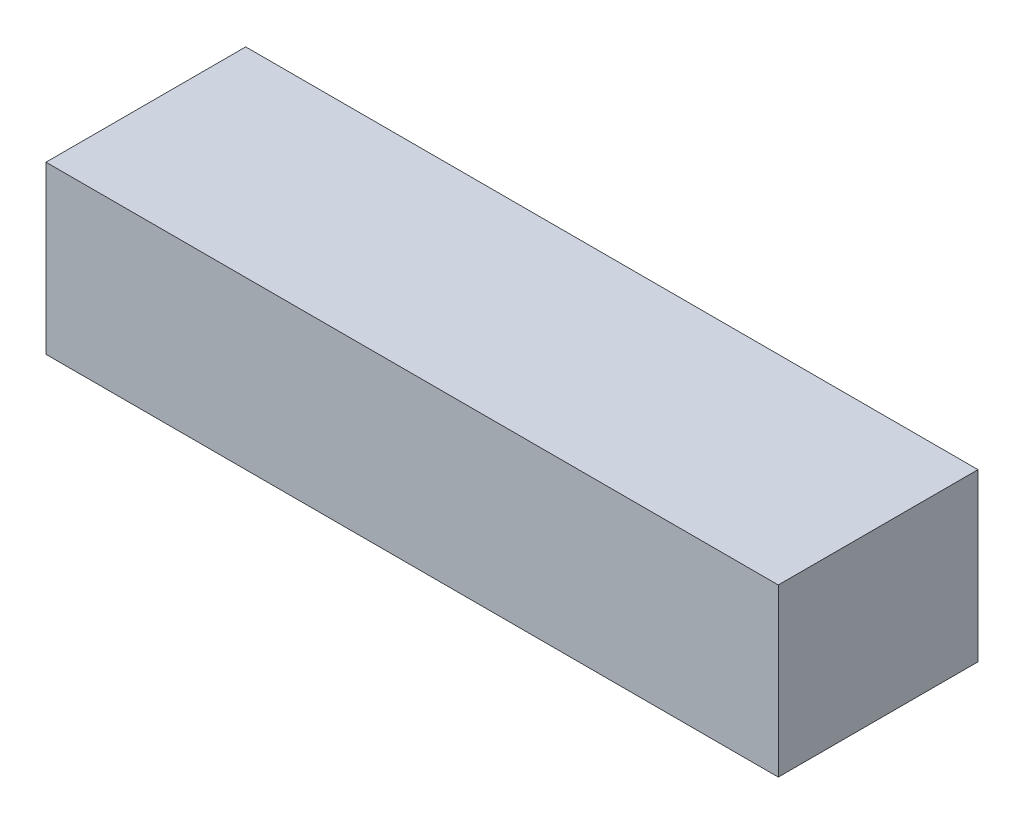
ISO-10303-21;
HEADER;
FILE_DESCRIPTION(('STEP AP214'),'2;1');
FILE_NAME('part.step','',(''),(''),'','','');
FILE_SCHEMA(('AUTOMOTIVE_DESIGN { 1 0 10303 214 1 1 1 1 }'));
ENDSEC;
DATA;
#1=APPLICATION_CONTEXT('core data for automotive mechanical design processes');
#2=APPLICATION_PROTOCOL_DEFINITION('international standard','automotive_design',2000,#1);
#3=PRODUCT_CONTEXT('',#1,'mechanical');
#4=PRODUCT('Part','Part','',(#3));
#5=PRODUCT_RELATED_PRODUCT_CATEGORY('part','',(#4));
#6=PRODUCT_DEFINITION_FORMATION('','',#4);
#7=PRODUCT_DEFINITION_CONTEXT('part definition',#1,'design');
#8=PRODUCT_DEFINITION('design','',#6,#7);
#9=PRODUCT_DEFINITION_SHAPE('','',#8);
#10=(LENGTH_UNIT() NAMED_UNIT(*) SI_UNIT(.MILLI.,.METRE.));
#11=(NAMED_UNIT(*) PLANE_ANGLE_UNIT() SI_UNIT($,.RADIAN.));
#12=(NAMED_UNIT(*) SI_UNIT($,.STERADIAN.) SOLID_ANGLE_UNIT());
#13=UNCERTAINTY_MEASURE_WITH_UNIT(LENGTH_MEASURE(1.E-05),#10,'distance_accuracy_value','');
#14=(GEOMETRIC_REPRESENTATION_CONTEXT(3) GLOBAL_UNCERTAINTY_ASSIGNED_CONTEXT((#13)) GLOBAL_UNIT_ASSIGNED_CONTEXT((#10,
#11,#12)) REPRESENTATION_CONTEXT('',''));
#15=CARTESIAN_POINT('',(0.,0.,0.));
#16=DIRECTION('',(0.,0.,1.));
#17=DIRECTION('',(1.,0.,0.));
#18=AXIS2_PLACEMENT_3D('',#15,#16,#17);
#19=CARTESIAN_POINT('',(-147.278171986584,50.,-92.1951219512195));
#20=DIRECTION('',(1.,0.,0.));
#21=DIRECTION('',(0.,0.,-1.));
#22=AXIS2_PLACEMENT_3D('',#19,#20,#21);
#23=PLANE('',#22);
#24=DIRECTION('',(0.,0.,1.));
#25=VECTOR('',#24,1.);
#26=CARTESIAN_POINT('',(-147.278171986584,0.,-92.1951219512195));
#27=LINE('',#26,#25);
#28=CARTESIAN_POINT('',(-147.278171986584,0.,-92.1951219512195));
#29=VERTEX_POINT('',#28);
#30=CARTESIAN_POINT('',(-147.278171986584,0.,-32.1951219512195));
#31=VERTEX_POINT('',#30);
#32=EDGE_CURVE('E113',#29,#31,#27,.T.);
#33=ORIENTED_EDGE('',*,*,#32,.T.);
#34=DIRECTION('',(0.,-1.,0.));
#35=VECTOR('',#34,1.);
#36=CARTESIAN_POINT('',(-147.278171986584,50.,-32.1951219512195));
#37=LINE('',#36,#35);
#38=CARTESIAN_POINT('',(-147.278171986584,50.,-32.1951219512195));
#39=VERTEX_POINT('',#38);
#40=EDGE_CURVE('E11',#39,#31,#37,.T.);
#41=ORIENTED_EDGE('',*,*,#40,.F.);
#42=DIRECTION('',(0.,0.,1.));
#43=VECTOR('',#42,1.);
#44=CARTESIAN_POINT('',(-147.278171986584,50.,-92.1951219512195));
#45=LINE('',#44,#43);
#46=CARTESIAN_POINT('',(-147.278171986584,50.,-92.1951219512195));
#47=VERTEX_POINT('',#46);
#48=EDGE_CURVE('E97',#47,#39,#45,.T.);
#49=ORIENTED_EDGE('',*,*,#48,.F.);
#50=DIRECTION('',(0.,-1.,0.));
#51=VECTOR('',#50,1.);
#52=CARTESIAN_POINT('',(-147.278171986584,50.,-92.1951219512195));
#53=LINE('',#52,#51);
#54=EDGE_CURVE('E109',#47,#29,#53,.T.);
#55=ORIENTED_EDGE('',*,*,#54,.T.);
#56=EDGE_LOOP('',(#33,#41,#49,#55));
#57=FACE_BOUND('',#56,.T.);
#58=ADVANCED_FACE('F45',(#57),#23,.F.);
#59=CARTESIAN_POINT('',(-147.278171986584,50.,-32.1951219512195));
#60=DIRECTION('',(0.,0.,-1.));
#61=DIRECTION('',(-1.,0.,0.));
#62=AXIS2_PLACEMENT_3D('',#59,#60,#61);
#63=PLANE('',#62);
#64=DIRECTION('',(1.,0.,0.));
#65=VECTOR('',#64,1.);
#66=CARTESIAN_POINT('',(-147.278171986584,0.,-32.1951219512195));
#67=LINE('',#66,#65);
#68=CARTESIAN_POINT('',(72.7218280134158,0.,-32.1951219512195));
#69=VERTEX_POINT('',#68);
#70=EDGE_CURVE('E102',#31,#69,#67,.T.);
#71=ORIENTED_EDGE('',*,*,#70,.T.);
#72=DIRECTION('',(0.,-1.,0.));
#73=VECTOR('',#72,1.);
#74=CARTESIAN_POINT('',(72.7218280134158,50.,-32.1951219512195));
#75=LINE('',#74,#73);
#76=CARTESIAN_POINT('',(72.7218280134158,50.,-32.1951219512195));
#77=VERTEX_POINT('',#76);
#78=EDGE_CURVE('E54',#77,#69,#75,.T.);
#79=ORIENTED_EDGE('',*,*,#78,.F.);
#80=DIRECTION('',(1.,0.,0.));
#81=VECTOR('',#80,1.);
#82=CARTESIAN_POINT('',(-147.278171986584,50.,-32.1951219512195));
#83=LINE('',#82,#81);
#84=EDGE_CURVE('E92',#39,#77,#83,.T.);
#85=ORIENTED_EDGE('',*,*,#84,.F.);
#86=ORIENTED_EDGE('',*,*,#40,.T.);
#87=EDGE_LOOP('',(#71,#79,#85,#86));
#88=FACE_BOUND('',#87,.T.);
#89=ADVANCED_FACE('F101',(#88),#63,.F.);
#90=CARTESIAN_POINT('',(72.7218280134158,50.,-92.1951219512195));
#91=DIRECTION('',(-1.,0.,0.));
#92=DIRECTION('',(0.,0.,1.));
#93=AXIS2_PLACEMENT_3D('',#90,#91,#92);
#94=PLANE('',#93);
#95=DIRECTION('',(0.,0.,-1.));
#96=VECTOR('',#95,1.);
#97=CARTESIAN_POINT('',(72.7218280134158,0.,-92.1951219512195));
#98=LINE('',#97,#96);
#99=CARTESIAN_POINT('',(72.7218280134158,0.,-92.1951219512195));
#100=VERTEX_POINT('',#99);
#101=EDGE_CURVE('E79',#69,#100,#98,.T.);
#102=ORIENTED_EDGE('',*,*,#101,.T.);
#103=DIRECTION('',(0.,-1.,0.));
#104=VECTOR('',#103,1.);
#105=CARTESIAN_POINT('',(72.7218280134158,50.,-92.1951219512195));
#106=LINE('',#105,#104);
#107=CARTESIAN_POINT('',(72.7218280134158,50.,-92.1951219512195));
#108=VERTEX_POINT('',#107);
#109=EDGE_CURVE('E104',#108,#100,#106,.T.);
#110=ORIENTED_EDGE('',*,*,#109,.F.);
#111=DIRECTION('',(0.,0.,-1.));
#112=VECTOR('',#111,1.);
#113=CARTESIAN_POINT('',(72.7218280134158,50.,-92.1951219512195));
#114=LINE('',#113,#112);
#115=EDGE_CURVE('E95',#77,#108,#114,.T.);
#116=ORIENTED_EDGE('',*,*,#115,.F.);
#117=ORIENTED_EDGE('',*,*,#78,.T.);
#118=EDGE_LOOP('',(#102,#110,#116,#117));
#119=FACE_BOUND('',#118,.T.);
#120=ADVANCED_FACE('F105',(#119),#94,.F.);
#121=CARTESIAN_POINT('',(-147.278171986584,50.,-92.1951219512195));
#122=DIRECTION('',(0.,0.,1.));
#123=DIRECTION('',(1.,0.,0.));
#124=AXIS2_PLACEMENT_3D('',#121,#122,#123);
#125=PLANE('',#124);
#126=DIRECTION('',(-1.,0.,0.));
#127=VECTOR('',#126,1.);
#128=CARTESIAN_POINT('',(-147.278171986584,0.,-92.1951219512195));
#129=LINE('',#128,#127);
#130=EDGE_CURVE('E85',#100,#29,#129,.T.);
#131=ORIENTED_EDGE('',*,*,#130,.T.);
#132=ORIENTED_EDGE('',*,*,#54,.F.);
#133=DIRECTION('',(-1.,0.,0.));
#134=VECTOR('',#133,1.);
#135=CARTESIAN_POINT('',(-147.278171986584,50.,-92.1951219512195));
#136=LINE('',#135,#134);
#137=EDGE_CURVE('E62',#108,#47,#136,.T.);
#138=ORIENTED_EDGE('',*,*,#137,.F.);
#139=ORIENTED_EDGE('',*,*,#109,.T.);
#140=EDGE_LOOP('',(#131,#132,#138,#139));
#141=FACE_BOUND('',#140,.T.);
#142=ADVANCED_FACE('F126',(#141),#125,.F.);
#143=CARTESIAN_POINT('',(0.,50.,0.));
#144=DIRECTION('',(0.,1.,0.));
#145=DIRECTION('',(0.,0.,1.));
#146=AXIS2_PLACEMENT_3D('',#143,#144,#145);
#147=PLANE('',#146);
#148=ORIENTED_EDGE('',*,*,#48,.T.);
#149=ORIENTED_EDGE('',*,*,#84,.T.);
#150=ORIENTED_EDGE('',*,*,#115,.T.);
#151=ORIENTED_EDGE('',*,*,#137,.T.);
#152=EDGE_LOOP('',(#148,#149,#150,#151));
#153=FACE_BOUND('',#152,.T.);
#154=ADVANCED_FACE('F93',(#153),#147,.T.);
#155=CARTESIAN_POINT('',(0.,0.,0.));
#156=DIRECTION('',(0.,1.,0.));
#157=DIRECTION('',(0.,0.,1.));
#158=AXIS2_PLACEMENT_3D('',#155,#156,#157);
#159=PLANE('',#158);
#160=ORIENTED_EDGE('',*,*,#32,.F.);
#161=ORIENTED_EDGE('',*,*,#130,.F.);
#162=ORIENTED_EDGE('',*,*,#101,.F.);
#163=ORIENTED_EDGE('',*,*,#70,.F.);
#164=EDGE_LOOP('',(#160,#161,#162,#163));
#165=FACE_BOUND('',#164,.T.);
#166=ADVANCED_FACE('F129',(#165),#159,.F.);
#167=CLOSED_SHELL('',(#58,#89,#120,#142,#154,#166));
#168=MANIFOLD_SOLID_BREP('B2',#167);
#169=ADVANCED_BREP_SHAPE_REPRESENTATION('',(#18,#168),#14);
#170=SHAPE_DEFINITION_REPRESENTATION(#9,#169);
ENDSEC;
END-ISO-10303-21;
